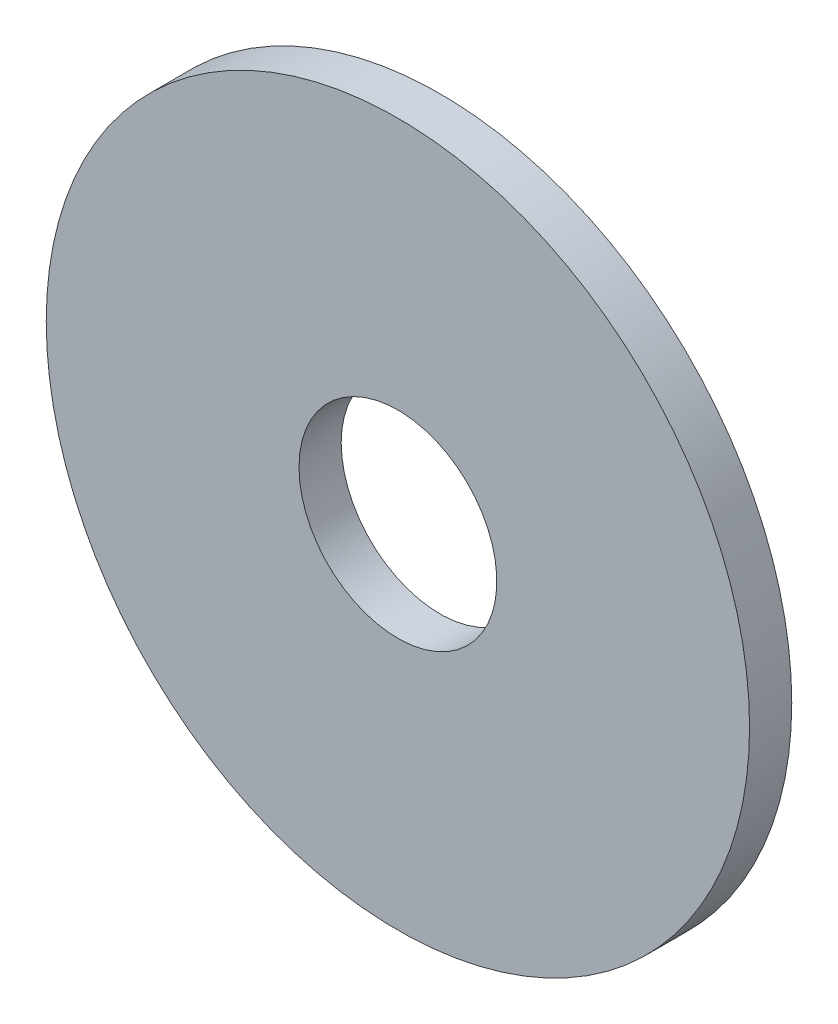
ISO-10303-21;
HEADER;
FILE_DESCRIPTION(('STEP AP214'),'2;1');
FILE_NAME('part.step','',(''),(''),'','','');
FILE_SCHEMA(('AUTOMOTIVE_DESIGN { 1 0 10303 214 1 1 1 1 }'));
ENDSEC;
DATA;
#1=APPLICATION_CONTEXT('core data for automotive mechanical design processes');
#2=APPLICATION_PROTOCOL_DEFINITION('international standard','automotive_design',2000,#1);
#3=PRODUCT_CONTEXT('',#1,'mechanical');
#4=PRODUCT('Part','Part','',(#3));
#5=PRODUCT_RELATED_PRODUCT_CATEGORY('part','',(#4));
#6=PRODUCT_DEFINITION_FORMATION('','',#4);
#7=PRODUCT_DEFINITION_CONTEXT('part definition',#1,'design');
#8=PRODUCT_DEFINITION('design','',#6,#7);
#9=PRODUCT_DEFINITION_SHAPE('','',#8);
#10=(LENGTH_UNIT() NAMED_UNIT(*) SI_UNIT(.MILLI.,.METRE.));
#11=(NAMED_UNIT(*) PLANE_ANGLE_UNIT() SI_UNIT($,.RADIAN.));
#12=(NAMED_UNIT(*) SI_UNIT($,.STERADIAN.) SOLID_ANGLE_UNIT());
#13=UNCERTAINTY_MEASURE_WITH_UNIT(LENGTH_MEASURE(1.E-05),#10,'distance_accuracy_value','');
#14=(GEOMETRIC_REPRESENTATION_CONTEXT(3) GLOBAL_UNCERTAINTY_ASSIGNED_CONTEXT((#13)) GLOBAL_UNIT_ASSIGNED_CONTEXT((#10,
#11,#12)) REPRESENTATION_CONTEXT('',''));
#15=CARTESIAN_POINT('',(0.,0.,0.));
#16=DIRECTION('',(0.,0.,1.));
#17=DIRECTION('',(1.,0.,0.));
#18=AXIS2_PLACEMENT_3D('',#15,#16,#17);
#19=CARTESIAN_POINT('',(0.,0.,0.762));
#20=DIRECTION('',(0.,0.,1.));
#21=DIRECTION('',(1.,0.,0.));
#22=AXIS2_PLACEMENT_3D('',#19,#20,#21);
#23=PLANE('',#22);
#24=CARTESIAN_POINT('',(0.,0.,0.762));
#25=DIRECTION('',(0.,0.,1.));
#26=DIRECTION('',(1.,0.,0.));
#27=AXIS2_PLACEMENT_3D('',#24,#25,#26);
#28=CIRCLE('',#27,12.7);
#29=CARTESIAN_POINT('',(-12.7,0.,0.762));
#30=VERTEX_POINT('',#29);
#31=EDGE_CURVE('E10',#30,#30,#28,.T.);
#32=ORIENTED_EDGE('',*,*,#31,.T.);
#33=EDGE_LOOP('',(#32));
#34=FACE_BOUND('',#33,.T.);
#35=CARTESIAN_POINT('',(0.,0.,0.762));
#36=DIRECTION('',(0.,0.,1.));
#37=DIRECTION('',(1.,0.,0.));
#38=AXIS2_PLACEMENT_3D('',#35,#36,#37);
#39=CIRCLE('',#38,3.571875);
#40=CARTESIAN_POINT('',(-3.571875,0.,0.762));
#41=VERTEX_POINT('',#40);
#42=EDGE_CURVE('E43',#41,#41,#39,.T.);
#43=ORIENTED_EDGE('',*,*,#42,.F.);
#44=EDGE_LOOP('',(#43));
#45=FACE_BOUND('',#44,.T.);
#46=ADVANCED_FACE('F32',(#34,#45),#23,.T.);
#47=CARTESIAN_POINT('',(0.,0.,-0.762));
#48=DIRECTION('',(0.,0.,1.));
#49=DIRECTION('',(1.,0.,0.));
#50=AXIS2_PLACEMENT_3D('',#47,#48,#49);
#51=PLANE('',#50);
#52=CARTESIAN_POINT('',(0.,0.,-0.762));
#53=DIRECTION('',(0.,0.,1.));
#54=DIRECTION('',(1.,0.,0.));
#55=AXIS2_PLACEMENT_3D('',#52,#53,#54);
#56=CIRCLE('',#55,12.7);
#57=CARTESIAN_POINT('',(-12.7,0.,-0.762));
#58=VERTEX_POINT('',#57);
#59=EDGE_CURVE('E36',#58,#58,#56,.T.);
#60=ORIENTED_EDGE('',*,*,#59,.F.);
#61=EDGE_LOOP('',(#60));
#62=FACE_BOUND('',#61,.T.);
#63=CARTESIAN_POINT('',(0.,0.,-0.762));
#64=DIRECTION('',(0.,0.,1.));
#65=DIRECTION('',(1.,0.,0.));
#66=AXIS2_PLACEMENT_3D('',#63,#64,#65);
#67=CIRCLE('',#66,3.571875);
#68=CARTESIAN_POINT('',(-3.571875,0.,-0.762));
#69=VERTEX_POINT('',#68);
#70=EDGE_CURVE('E45',#69,#69,#67,.T.);
#71=ORIENTED_EDGE('',*,*,#70,.T.);
#72=EDGE_LOOP('',(#71));
#73=FACE_BOUND('',#72,.T.);
#74=ADVANCED_FACE('F55',(#62,#73),#51,.F.);
#75=CARTESIAN_POINT('',(0.,0.,0.762));
#76=DIRECTION('',(0.,0.,-1.));
#77=DIRECTION('',(-1.,0.,0.));
#78=AXIS2_PLACEMENT_3D('',#75,#76,#77);
#79=CYLINDRICAL_SURFACE('',#78,12.7);
#80=CARTESIAN_POINT('',(-12.7,0.,0.762));
#81=CARTESIAN_POINT('',(-12.7,0.,0.746125));
#82=CARTESIAN_POINT('',(-12.7,0.,0.73025));
#83=CARTESIAN_POINT('',(-12.7,0.,0.6985));
#84=CARTESIAN_POINT('',(-12.7,0.,0.682625));
#85=CARTESIAN_POINT('',(-12.7,0.,0.650875));
#86=CARTESIAN_POINT('',(-12.7,0.,0.635));
#87=CARTESIAN_POINT('',(-12.7,0.,0.60325));
#88=CARTESIAN_POINT('',(-12.7,0.,0.587375));
#89=CARTESIAN_POINT('',(-12.7,0.,0.555625));
#90=CARTESIAN_POINT('',(-12.7,0.,0.53975));
#91=CARTESIAN_POINT('',(-12.7,0.,0.508));
#92=CARTESIAN_POINT('',(-12.7,0.,0.492125));
#93=CARTESIAN_POINT('',(-12.7,0.,0.460375));
#94=CARTESIAN_POINT('',(-12.7,0.,0.4445));
#95=CARTESIAN_POINT('',(-12.7,0.,0.41275));
#96=CARTESIAN_POINT('',(-12.7,0.,0.396875));
#97=CARTESIAN_POINT('',(-12.7,0.,0.365125));
#98=CARTESIAN_POINT('',(-12.7,0.,0.34925));
#99=CARTESIAN_POINT('',(-12.7,0.,0.3175));
#100=CARTESIAN_POINT('',(-12.7,0.,0.301625));
#101=CARTESIAN_POINT('',(-12.7,0.,0.269875));
#102=CARTESIAN_POINT('',(-12.7,0.,0.254));
#103=CARTESIAN_POINT('',(-12.7,0.,0.22225));
#104=CARTESIAN_POINT('',(-12.7,0.,0.206375));
#105=CARTESIAN_POINT('',(-12.7,0.,0.174625));
#106=CARTESIAN_POINT('',(-12.7,0.,0.15875));
#107=CARTESIAN_POINT('',(-12.7,0.,0.127));
#108=CARTESIAN_POINT('',(-12.7,0.,0.111125));
#109=CARTESIAN_POINT('',(-12.7,0.,0.0793750000000001));
#110=CARTESIAN_POINT('',(-12.7,0.,0.0635));
#111=CARTESIAN_POINT('',(-12.7,0.,0.03175));
#112=CARTESIAN_POINT('',(-12.7,0.,0.015875));
#113=CARTESIAN_POINT('',(-12.7,0.,-0.015875));
#114=CARTESIAN_POINT('',(-12.7,0.,-0.03175));
#115=CARTESIAN_POINT('',(-12.7,0.,-0.0635));
#116=CARTESIAN_POINT('',(-12.7,0.,-0.0793750000000001));
#117=CARTESIAN_POINT('',(-12.7,0.,-0.111125));
#118=CARTESIAN_POINT('',(-12.7,0.,-0.127));
#119=CARTESIAN_POINT('',(-12.7,0.,-0.15875));
#120=CARTESIAN_POINT('',(-12.7,0.,-0.174625));
#121=CARTESIAN_POINT('',(-12.7,0.,-0.206375));
#122=CARTESIAN_POINT('',(-12.7,0.,-0.22225));
#123=CARTESIAN_POINT('',(-12.7,0.,-0.254));
#124=CARTESIAN_POINT('',(-12.7,0.,-0.269875));
#125=CARTESIAN_POINT('',(-12.7,0.,-0.301625));
#126=CARTESIAN_POINT('',(-12.7,0.,-0.3175));
#127=CARTESIAN_POINT('',(-12.7,0.,-0.34925));
#128=CARTESIAN_POINT('',(-12.7,0.,-0.365125));
#129=CARTESIAN_POINT('',(-12.7,0.,-0.396875));
#130=CARTESIAN_POINT('',(-12.7,0.,-0.41275));
#131=CARTESIAN_POINT('',(-12.7,0.,-0.4445));
#132=CARTESIAN_POINT('',(-12.7,0.,-0.460375));
#133=CARTESIAN_POINT('',(-12.7,0.,-0.492125));
#134=CARTESIAN_POINT('',(-12.7,0.,-0.508));
#135=CARTESIAN_POINT('',(-12.7,0.,-0.53975));
#136=CARTESIAN_POINT('',(-12.7,0.,-0.555625));
#137=CARTESIAN_POINT('',(-12.7,0.,-0.587375));
#138=CARTESIAN_POINT('',(-12.7,0.,-0.60325));
#139=CARTESIAN_POINT('',(-12.7,0.,-0.635));
#140=CARTESIAN_POINT('',(-12.7,0.,-0.650875));
#141=CARTESIAN_POINT('',(-12.7,0.,-0.682625));
#142=CARTESIAN_POINT('',(-12.7,0.,-0.6985));
#143=CARTESIAN_POINT('',(-12.7,0.,-0.73025));
#144=CARTESIAN_POINT('',(-12.7,0.,-0.746125));
#145=CARTESIAN_POINT('',(-12.7,0.,-0.762));
#146=B_SPLINE_CURVE_WITH_KNOTS('',3,(#80,#81,#82,#83,#84,#85,#86,#87,#88,#89,#90,#91,#92,#93,
#94,#95,#96,#97,#98,#99,#100,#101,#102,#103,#104,#105,#106,#107,#108,#109,#110,#111,#112,#113,
#114,#115,#116,#117,#118,#119,#120,#121,#122,#123,#124,#125,#126,#127,#128,#129,#130,#131,#132,
#133,#134,#135,#136,#137,#138,#139,#140,#141,#142,#143,#144,#145),.UNSPECIFIED.,.F.,.F.,(4,2,2,
2,2,2,2,2,2,2,2,2,2,2,2,2,2,2,2,2,2,2,2,2,2,2,2,2,2,2,2,2,4),(0.,0.047625,0.0952500000000001,
0.142875,0.1905,0.238125,0.28575,0.333375,0.381,0.428625,0.47625,0.523875,0.5715,0.619125,
0.66675,0.714375,0.762,0.809625,0.85725,0.904875,0.9525,1.000125,1.04775,1.095375,1.143,
1.190625,1.23825,1.285875,1.3335,1.381125,1.42875,1.476375,1.524),.UNSPECIFIED.);
#147=EDGE_CURVE('BSEAM34',#30,#58,#146,.T.);
#148=ORIENTED_EDGE('',*,*,#31,.F.);
#149=ORIENTED_EDGE('',*,*,#59,.T.);
#150=ORIENTED_EDGE('',*,*,#147,.T.);
#151=ORIENTED_EDGE('',*,*,#147,.F.);
#152=EDGE_LOOP('',(#148,#150,#149,#151));
#153=FACE_BOUND('',#152,.T.);
#154=ADVANCED_FACE('F34',(#153),#79,.T.);
#155=CARTESIAN_POINT('',(0.,0.,0.762));
#156=DIRECTION('',(0.,0.,-1.));
#157=DIRECTION('',(-1.,0.,0.));
#158=AXIS2_PLACEMENT_3D('',#155,#156,#157);
#159=CYLINDRICAL_SURFACE('',#158,3.571875);
#160=CARTESIAN_POINT('',(-3.571875,0.,0.762));
#161=CARTESIAN_POINT('',(-3.571875,0.,0.746125));
#162=CARTESIAN_POINT('',(-3.571875,0.,0.73025));
#163=CARTESIAN_POINT('',(-3.571875,0.,0.6985));
#164=CARTESIAN_POINT('',(-3.571875,0.,0.682625));
#165=CARTESIAN_POINT('',(-3.571875,0.,0.650875));
#166=CARTESIAN_POINT('',(-3.571875,0.,0.635));
#167=CARTESIAN_POINT('',(-3.571875,0.,0.60325));
#168=CARTESIAN_POINT('',(-3.571875,0.,0.587375));
#169=CARTESIAN_POINT('',(-3.571875,0.,0.555625));
#170=CARTESIAN_POINT('',(-3.571875,0.,0.53975));
#171=CARTESIAN_POINT('',(-3.571875,0.,0.508));
#172=CARTESIAN_POINT('',(-3.571875,0.,0.492125));
#173=CARTESIAN_POINT('',(-3.571875,0.,0.460375));
#174=CARTESIAN_POINT('',(-3.571875,0.,0.4445));
#175=CARTESIAN_POINT('',(-3.571875,0.,0.41275));
#176=CARTESIAN_POINT('',(-3.571875,0.,0.396875));
#177=CARTESIAN_POINT('',(-3.571875,0.,0.365125));
#178=CARTESIAN_POINT('',(-3.571875,0.,0.34925));
#179=CARTESIAN_POINT('',(-3.571875,0.,0.3175));
#180=CARTESIAN_POINT('',(-3.571875,0.,0.301625));
#181=CARTESIAN_POINT('',(-3.571875,0.,0.269875));
#182=CARTESIAN_POINT('',(-3.571875,0.,0.254));
#183=CARTESIAN_POINT('',(-3.571875,0.,0.22225));
#184=CARTESIAN_POINT('',(-3.571875,0.,0.206375));
#185=CARTESIAN_POINT('',(-3.571875,0.,0.174625));
#186=CARTESIAN_POINT('',(-3.571875,0.,0.15875));
#187=CARTESIAN_POINT('',(-3.571875,0.,0.127));
#188=CARTESIAN_POINT('',(-3.571875,0.,0.111125));
#189=CARTESIAN_POINT('',(-3.571875,0.,0.0793749999999999));
#190=CARTESIAN_POINT('',(-3.571875,0.,0.0634999999999999));
#191=CARTESIAN_POINT('',(-3.571875,0.,0.0317499999999999));
#192=CARTESIAN_POINT('',(-3.571875,0.,0.0158749999999999));
#193=CARTESIAN_POINT('',(-3.571875,0.,-0.0158750000000001));
#194=CARTESIAN_POINT('',(-3.571875,0.,-0.0317500000000001));
#195=CARTESIAN_POINT('',(-3.571875,0.,-0.0635000000000002));
#196=CARTESIAN_POINT('',(-3.571875,0.,-0.0793750000000002));
#197=CARTESIAN_POINT('',(-3.571875,0.,-0.111125));
#198=CARTESIAN_POINT('',(-3.571875,0.,-0.127));
#199=CARTESIAN_POINT('',(-3.571875,0.,-0.15875));
#200=CARTESIAN_POINT('',(-3.571875,0.,-0.174625));
#201=CARTESIAN_POINT('',(-3.571875,0.,-0.206375));
#202=CARTESIAN_POINT('',(-3.571875,0.,-0.22225));
#203=CARTESIAN_POINT('',(-3.571875,0.,-0.254));
#204=CARTESIAN_POINT('',(-3.571875,0.,-0.269875));
#205=CARTESIAN_POINT('',(-3.571875,0.,-0.301625));
#206=CARTESIAN_POINT('',(-3.571875,0.,-0.3175));
#207=CARTESIAN_POINT('',(-3.571875,0.,-0.34925));
#208=CARTESIAN_POINT('',(-3.571875,0.,-0.365125));
#209=CARTESIAN_POINT('',(-3.571875,0.,-0.396875));
#210=CARTESIAN_POINT('',(-3.571875,0.,-0.41275));
#211=CARTESIAN_POINT('',(-3.571875,0.,-0.4445));
#212=CARTESIAN_POINT('',(-3.571875,0.,-0.460375));
#213=CARTESIAN_POINT('',(-3.571875,0.,-0.492125));
#214=CARTESIAN_POINT('',(-3.571875,0.,-0.508));
#215=CARTESIAN_POINT('',(-3.571875,0.,-0.53975));
#216=CARTESIAN_POINT('',(-3.571875,0.,-0.555625));
#217=CARTESIAN_POINT('',(-3.571875,0.,-0.587375));
#218=CARTESIAN_POINT('',(-3.571875,0.,-0.60325));
#219=CARTESIAN_POINT('',(-3.571875,0.,-0.635));
#220=CARTESIAN_POINT('',(-3.571875,0.,-0.650875));
#221=CARTESIAN_POINT('',(-3.571875,0.,-0.682625));
#222=CARTESIAN_POINT('',(-3.571875,0.,-0.6985));
#223=CARTESIAN_POINT('',(-3.571875,0.,-0.73025));
#224=CARTESIAN_POINT('',(-3.571875,0.,-0.746125));
#225=CARTESIAN_POINT('',(-3.571875,0.,-0.762));
#226=B_SPLINE_CURVE_WITH_KNOTS('',3,(#160,#161,#162,#163,#164,#165,#166,#167,#168,#169,#170,
#171,#172,#173,#174,#175,#176,#177,#178,#179,#180,#181,#182,#183,#184,#185,#186,#187,#188,#189,
#190,#191,#192,#193,#194,#195,#196,#197,#198,#199,#200,#201,#202,#203,#204,#205,#206,#207,#208,
#209,#210,#211,#212,#213,#214,#215,#216,#217,#218,#219,#220,#221,#222,#223,#224,#225),
.UNSPECIFIED.,.F.,.F.,(4,2,2,2,2,2,2,2,2,2,2,2,2,2,2,2,2,2,2,2,2,2,2,2,2,2,2,2,2,2,2,2,4),(0.,
0.0476249999999999,0.09525,0.142875,0.1905,0.238125,0.28575,0.333375,0.381,0.428625,0.47625,
0.523875,0.5715,0.619125,0.66675,0.714375,0.762,0.809625,0.85725,0.904875,0.9525,1.000125,
1.04775,1.095375,1.143,1.190625,1.23825,1.285875,1.3335,1.381125,1.42875,1.476375,1.524),.UNSPECIFIED.);
#227=EDGE_CURVE('BSEAM51',#41,#69,#226,.T.);
#228=ORIENTED_EDGE('',*,*,#42,.T.);
#229=ORIENTED_EDGE('',*,*,#70,.F.);
#230=ORIENTED_EDGE('',*,*,#227,.T.);
#231=ORIENTED_EDGE('',*,*,#227,.F.);
#232=EDGE_LOOP('',(#228,#230,#229,#231));
#233=FACE_BOUND('',#232,.T.);
#234=ADVANCED_FACE('F51',(#233),#159,.F.);
#235=CLOSED_SHELL('',(#46,#74,#154,#234));
#236=MANIFOLD_SOLID_BREP('B2',#235);
#237=ADVANCED_BREP_SHAPE_REPRESENTATION('',(#18,#236),#14);
#238=SHAPE_DEFINITION_REPRESENTATION(#9,#237);
ENDSEC;
END-ISO-10303-21;
